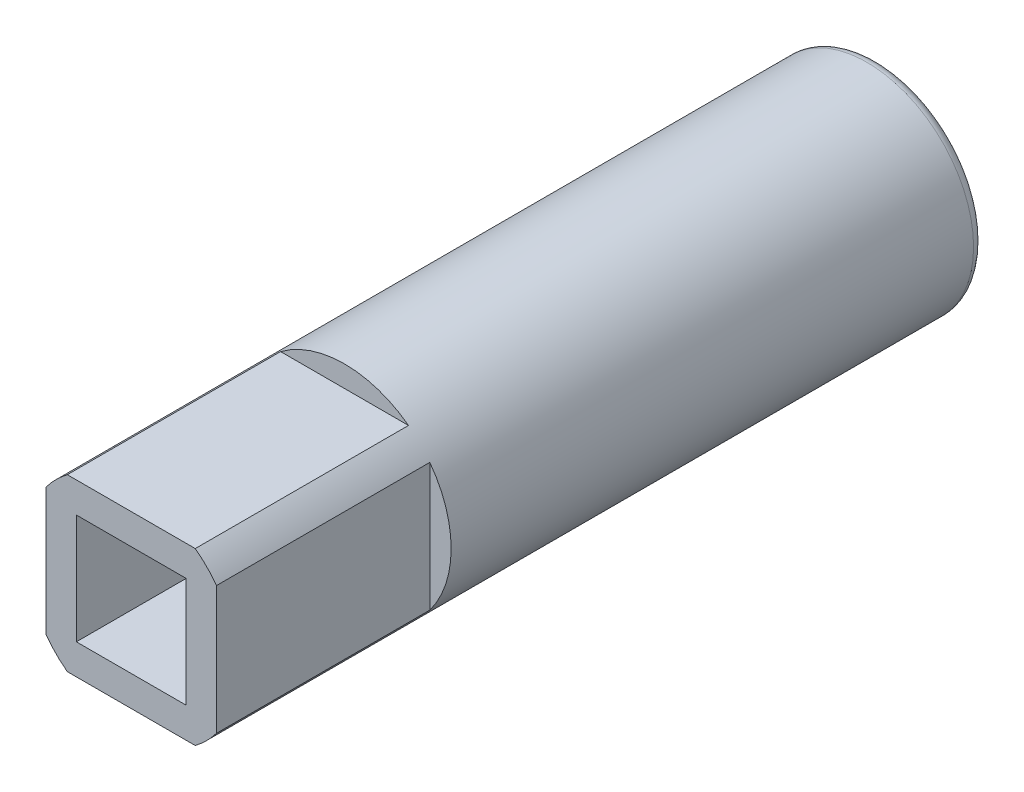
ISO-10303-21;
HEADER;
FILE_DESCRIPTION(('STEP AP214'),'2;1');
FILE_NAME('part.step','',(''),(''),'','','');
FILE_SCHEMA(('AUTOMOTIVE_DESIGN { 1 0 10303 214 1 1 1 1 }'));
ENDSEC;
DATA;
#1=APPLICATION_CONTEXT('core data for automotive mechanical design processes');
#2=APPLICATION_PROTOCOL_DEFINITION('international standard','automotive_design',2000,#1);
#3=PRODUCT_CONTEXT('',#1,'mechanical');
#4=PRODUCT('Part','Part','',(#3));
#5=PRODUCT_RELATED_PRODUCT_CATEGORY('part','',(#4));
#6=PRODUCT_DEFINITION_FORMATION('','',#4);
#7=PRODUCT_DEFINITION_CONTEXT('part definition',#1,'design');
#8=PRODUCT_DEFINITION('design','',#6,#7);
#9=PRODUCT_DEFINITION_SHAPE('','',#8);
#10=(LENGTH_UNIT() NAMED_UNIT(*) SI_UNIT(.MILLI.,.METRE.));
#11=(NAMED_UNIT(*) PLANE_ANGLE_UNIT() SI_UNIT($,.RADIAN.));
#12=(NAMED_UNIT(*) SI_UNIT($,.STERADIAN.) SOLID_ANGLE_UNIT());
#13=UNCERTAINTY_MEASURE_WITH_UNIT(LENGTH_MEASURE(1.E-05),#10,'distance_accuracy_value','');
#14=(GEOMETRIC_REPRESENTATION_CONTEXT(3) GLOBAL_UNCERTAINTY_ASSIGNED_CONTEXT((#13)) GLOBAL_UNIT_ASSIGNED_CONTEXT((#10,
#11,#12)) REPRESENTATION_CONTEXT('',''));
#15=CARTESIAN_POINT('',(0.,0.,0.));
#16=DIRECTION('',(0.,0.,1.));
#17=DIRECTION('',(1.,0.,0.));
#18=AXIS2_PLACEMENT_3D('',#15,#16,#17);
#19=CARTESIAN_POINT('',(0.,0.,25.));
#20=DIRECTION('',(0.,0.,1.));
#21=DIRECTION('',(1.,0.,0.));
#22=AXIS2_PLACEMENT_3D('',#19,#20,#21);
#23=PLANE('',#22);
#24=CARTESIAN_POINT('',(0.,0.,25.));
#25=DIRECTION('',(0.,0.,1.));
#26=DIRECTION('',(1.,0.,0.));
#27=AXIS2_PLACEMENT_3D('',#24,#25,#26);
#28=CIRCLE('',#27,5.);
#29=CARTESIAN_POINT('',(-4.,3.,25.));
#30=VERTEX_POINT('',#29);
#31=CARTESIAN_POINT('',(-4.,-3.,25.));
#32=VERTEX_POINT('',#31);
#33=EDGE_CURVE('E328',#30,#32,#28,.T.);
#34=ORIENTED_EDGE('',*,*,#33,.T.);
#35=DIRECTION('',(0.,1.,0.));
#36=VECTOR('',#35,1.);
#37=CARTESIAN_POINT('',(-4.,0.,25.));
#38=LINE('',#37,#36);
#39=EDGE_CURVE('E237',#32,#30,#38,.T.);
#40=ORIENTED_EDGE('',*,*,#39,.T.);
#41=EDGE_LOOP('',(#34,#40));
#42=FACE_BOUND('',#41,.T.);
#43=ADVANCED_FACE('F50',(#42),#23,.T.);
#44=CARTESIAN_POINT('',(3.,4.,25.));
#45=VERTEX_POINT('',#44);
#46=CARTESIAN_POINT('',(-3.,4.,25.));
#47=VERTEX_POINT('',#46);
#48=EDGE_CURVE('E324',#45,#47,#28,.T.);
#49=ORIENTED_EDGE('',*,*,#48,.T.);
#50=DIRECTION('',(1.,0.,0.));
#51=VECTOR('',#50,1.);
#52=CARTESIAN_POINT('',(0.,4.,25.));
#53=LINE('',#52,#51);
#54=EDGE_CURVE('E236',#47,#45,#53,.T.);
#55=ORIENTED_EDGE('',*,*,#54,.T.);
#56=EDGE_LOOP('',(#49,#55));
#57=FACE_BOUND('',#56,.T.);
#58=ADVANCED_FACE('F368',(#57),#23,.T.);
#59=DIRECTION('',(1.,0.,0.));
#60=VECTOR('',#59,1.);
#61=CARTESIAN_POINT('',(0.,-4.,25.));
#62=LINE('',#61,#60);
#63=CARTESIAN_POINT('',(-3.,-4.,25.));
#64=VERTEX_POINT('',#63);
#65=CARTESIAN_POINT('',(3.,-4.,25.));
#66=VERTEX_POINT('',#65);
#67=EDGE_CURVE('E216',#64,#66,#62,.T.);
#68=ORIENTED_EDGE('',*,*,#67,.F.);
#69=EDGE_CURVE('E325',#64,#66,#28,.T.);
#70=ORIENTED_EDGE('',*,*,#69,.T.);
#71=EDGE_LOOP('',(#68,#70));
#72=FACE_BOUND('',#71,.T.);
#73=ADVANCED_FACE('F336',(#72),#23,.T.);
#74=CARTESIAN_POINT('',(0.,0.,25.));
#75=DIRECTION('',(0.,0.,-1.));
#76=DIRECTION('',(-1.,0.,0.));
#77=AXIS2_PLACEMENT_3D('',#74,#75,#76);
#78=CYLINDRICAL_SURFACE('',#77,5.);
#79=CARTESIAN_POINT('',(0.,0.,0.5));
#80=DIRECTION('',(0.,0.,1.));
#81=DIRECTION('',(1.,0.,0.));
#82=AXIS2_PLACEMENT_3D('',#79,#80,#81);
#83=CIRCLE('',#82,5.);
#84=CARTESIAN_POINT('',(5.,0.,0.5));
#85=VERTEX_POINT('',#84);
#86=EDGE_CURVE('E57',#85,#85,#83,.T.);
#87=ORIENTED_EDGE('',*,*,#86,.T.);
#88=EDGE_LOOP('',(#87));
#89=FACE_BOUND('',#88,.T.);
#90=ORIENTED_EDGE('',*,*,#48,.F.);
#91=DIRECTION('',(0.,0.,-1.));
#92=VECTOR('',#91,1.);
#93=CARTESIAN_POINT('',(3.,4.,35.));
#94=LINE('',#93,#92);
#95=CARTESIAN_POINT('',(3.,4.,35.));
#96=VERTEX_POINT('',#95);
#97=EDGE_CURVE('E263',#96,#45,#94,.T.);
#98=ORIENTED_EDGE('',*,*,#97,.F.);
#99=CARTESIAN_POINT('',(0.,0.,35.));
#100=DIRECTION('',(0.,0.,1.));
#101=DIRECTION('',(1.,0.,0.));
#102=AXIS2_PLACEMENT_3D('',#99,#100,#101);
#103=CIRCLE('',#102,5.);
#104=CARTESIAN_POINT('',(4.,3.,35.));
#105=VERTEX_POINT('',#104);
#106=EDGE_CURVE('E217',#105,#96,#103,.T.);
#107=ORIENTED_EDGE('',*,*,#106,.F.);
#108=DIRECTION('',(0.,0.,-1.));
#109=VECTOR('',#108,1.);
#110=CARTESIAN_POINT('',(4.,3.,35.));
#111=LINE('',#110,#109);
#112=CARTESIAN_POINT('',(4.,3.,25.));
#113=VERTEX_POINT('',#112);
#114=EDGE_CURVE('E269',#105,#113,#111,.T.);
#115=ORIENTED_EDGE('',*,*,#114,.T.);
#116=CARTESIAN_POINT('',(4.,-3.,25.));
#117=VERTEX_POINT('',#116);
#118=EDGE_CURVE('E311',#117,#113,#28,.T.);
#119=ORIENTED_EDGE('',*,*,#118,.F.);
#120=DIRECTION('',(0.,0.,-1.));
#121=VECTOR('',#120,1.);
#122=CARTESIAN_POINT('',(4.,-3.,35.));
#123=LINE('',#122,#121);
#124=CARTESIAN_POINT('',(4.,-3.,35.));
#125=VERTEX_POINT('',#124);
#126=EDGE_CURVE('E275',#125,#117,#123,.T.);
#127=ORIENTED_EDGE('',*,*,#126,.F.);
#128=CARTESIAN_POINT('',(3.,-4.,35.));
#129=VERTEX_POINT('',#128);
#130=EDGE_CURVE('E212',#129,#125,#103,.T.);
#131=ORIENTED_EDGE('',*,*,#130,.F.);
#132=DIRECTION('',(0.,0.,-1.));
#133=VECTOR('',#132,1.);
#134=CARTESIAN_POINT('',(3.,-4.,35.));
#135=LINE('',#134,#133);
#136=EDGE_CURVE('E231',#129,#66,#135,.T.);
#137=ORIENTED_EDGE('',*,*,#136,.T.);
#138=ORIENTED_EDGE('',*,*,#69,.F.);
#139=DIRECTION('',(0.,0.,-1.));
#140=VECTOR('',#139,1.);
#141=CARTESIAN_POINT('',(-3.,-4.,35.));
#142=LINE('',#141,#140);
#143=CARTESIAN_POINT('',(-3.,-4.,35.));
#144=VERTEX_POINT('',#143);
#145=EDGE_CURVE('E247',#144,#64,#142,.T.);
#146=ORIENTED_EDGE('',*,*,#145,.F.);
#147=CARTESIAN_POINT('',(-4.,-3.,35.));
#148=VERTEX_POINT('',#147);
#149=EDGE_CURVE('E220',#148,#144,#103,.T.);
#150=ORIENTED_EDGE('',*,*,#149,.F.);
#151=DIRECTION('',(0.,0.,-1.));
#152=VECTOR('',#151,1.);
#153=CARTESIAN_POINT('',(-4.,-3.,35.));
#154=LINE('',#153,#152);
#155=EDGE_CURVE('E255',#148,#32,#154,.T.);
#156=ORIENTED_EDGE('',*,*,#155,.T.);
#157=ORIENTED_EDGE('',*,*,#33,.F.);
#158=DIRECTION('',(0.,0.,-1.));
#159=VECTOR('',#158,1.);
#160=CARTESIAN_POINT('',(-4.,3.,35.));
#161=LINE('',#160,#159);
#162=CARTESIAN_POINT('',(-4.,3.,35.));
#163=VERTEX_POINT('',#162);
#164=EDGE_CURVE('E257',#163,#30,#161,.T.);
#165=ORIENTED_EDGE('',*,*,#164,.F.);
#166=CARTESIAN_POINT('',(-3.,4.,35.));
#167=VERTEX_POINT('',#166);
#168=EDGE_CURVE('E225',#167,#163,#103,.T.);
#169=ORIENTED_EDGE('',*,*,#168,.F.);
#170=DIRECTION('',(0.,0.,-1.));
#171=VECTOR('',#170,1.);
#172=CARTESIAN_POINT('',(-3.,4.,35.));
#173=LINE('',#172,#171);
#174=EDGE_CURVE('E258',#167,#47,#173,.T.);
#175=ORIENTED_EDGE('',*,*,#174,.T.);
#176=EDGE_LOOP('',(#90,#98,#107,#115,#119,#127,#131,#137,#138,#146,#150,#156,#157,#165,#169,#175));
#177=FACE_BOUND('',#176,.T.);
#178=ADVANCED_FACE('F346',(#89,#177),#78,.T.);
#179=DIRECTION('',(0.,1.,0.));
#180=VECTOR('',#179,1.);
#181=CARTESIAN_POINT('',(4.,0.,25.));
#182=LINE('',#181,#180);
#183=EDGE_CURVE('E69',#117,#113,#182,.T.);
#184=ORIENTED_EDGE('',*,*,#183,.F.);
#185=ORIENTED_EDGE('',*,*,#118,.T.);
#186=EDGE_LOOP('',(#184,#185));
#187=FACE_BOUND('',#186,.T.);
#188=ADVANCED_FACE('F369',(#187),#23,.T.);
#189=CARTESIAN_POINT('',(0.,0.,0.));
#190=DIRECTION('',(0.,0.,1.));
#191=DIRECTION('',(1.,0.,0.));
#192=AXIS2_PLACEMENT_3D('',#189,#190,#191);
#193=PLANE('',#192);
#194=CARTESIAN_POINT('',(0.,0.,0.));
#195=DIRECTION('',(0.,0.,1.));
#196=DIRECTION('',(1.,0.,0.));
#197=AXIS2_PLACEMENT_3D('',#194,#195,#196);
#198=CIRCLE('',#197,4.5);
#199=CARTESIAN_POINT('',(4.5,0.,0.));
#200=VERTEX_POINT('',#199);
#201=EDGE_CURVE('E11',#200,#200,#198,.F.);
#202=ORIENTED_EDGE('',*,*,#201,.T.);
#203=EDGE_LOOP('',(#202));
#204=FACE_BOUND('',#203,.T.);
#205=DIRECTION('',(1.,0.,0.));
#206=VECTOR('',#205,1.);
#207=CARTESIAN_POINT('',(2.19845926514363,1.81363636363636,0.));
#208=LINE('',#207,#206);
#209=CARTESIAN_POINT('',(-2.19845926514363,1.81363636363636,0.));
#210=VERTEX_POINT('',#209);
#211=CARTESIAN_POINT('',(2.19845926514363,1.81363636363636,0.));
#212=VERTEX_POINT('',#211);
#213=EDGE_CURVE('E300',#210,#212,#208,.T.);
#214=ORIENTED_EDGE('',*,*,#213,.F.);
#215=CARTESIAN_POINT('',(0.,0.,0.));
#216=DIRECTION('',(0.,0.,-1.));
#217=DIRECTION('',(-1.,0.,0.));
#218=AXIS2_PLACEMENT_3D('',#215,#216,#217);
#219=CIRCLE('',#218,2.85);
#220=CARTESIAN_POINT('',(-2.221320345,-1.78556319543417,0.));
#221=VERTEX_POINT('',#220);
#222=EDGE_CURVE('E277',#221,#210,#219,.T.);
#223=ORIENTED_EDGE('',*,*,#222,.F.);
#224=DIRECTION('',(-1.,0.,0.));
#225=VECTOR('',#224,1.);
#226=CARTESIAN_POINT('',(2.221320345,-1.78556319543417,0.));
#227=LINE('',#226,#225);
#228=CARTESIAN_POINT('',(2.221320345,-1.78556319543417,0.));
#229=VERTEX_POINT('',#228);
#230=EDGE_CURVE('E285',#229,#221,#227,.T.);
#231=ORIENTED_EDGE('',*,*,#230,.F.);
#232=CARTESIAN_POINT('',(0.,0.,0.));
#233=DIRECTION('',(0.,0.,-1.));
#234=DIRECTION('',(-1.,0.,0.));
#235=AXIS2_PLACEMENT_3D('',#232,#233,#234);
#236=CIRCLE('',#235,2.85);
#237=EDGE_CURVE('E301',#212,#229,#236,.T.);
#238=ORIENTED_EDGE('',*,*,#237,.F.);
#239=EDGE_LOOP('',(#214,#223,#231,#238));
#240=FACE_BOUND('',#239,.T.);
#241=ADVANCED_FACE('F377',(#204,#240),#193,.F.);
#242=CARTESIAN_POINT('',(0.,0.,8.));
#243=DIRECTION('',(0.,0.,-1.));
#244=DIRECTION('',(-1.,0.,0.));
#245=AXIS2_PLACEMENT_3D('',#242,#243,#244);
#246=CYLINDRICAL_SURFACE('',#245,2.85);
#247=ORIENTED_EDGE('',*,*,#222,.T.);
#248=DIRECTION('',(0.,0.,-1.));
#249=VECTOR('',#248,1.);
#250=CARTESIAN_POINT('',(-2.19845926514363,1.81363636363636,8.));
#251=LINE('',#250,#249);
#252=CARTESIAN_POINT('',(-2.19845926514363,1.81363636363636,8.));
#253=VERTEX_POINT('',#252);
#254=EDGE_CURVE('E295',#253,#210,#251,.T.);
#255=ORIENTED_EDGE('',*,*,#254,.F.);
#256=CARTESIAN_POINT('',(0.,0.,8.));
#257=DIRECTION('',(0.,0.,-1.));
#258=DIRECTION('',(-1.,0.,0.));
#259=AXIS2_PLACEMENT_3D('',#256,#257,#258);
#260=CIRCLE('',#259,2.85);
#261=CARTESIAN_POINT('',(-2.221320345,-1.78556319543417,8.));
#262=VERTEX_POINT('',#261);
#263=EDGE_CURVE('E280',#262,#253,#260,.T.);
#264=ORIENTED_EDGE('',*,*,#263,.F.);
#265=DIRECTION('',(0.,0.,-1.));
#266=VECTOR('',#265,1.);
#267=CARTESIAN_POINT('',(-2.221320345,-1.78556319543417,8.));
#268=LINE('',#267,#266);
#269=EDGE_CURVE('E308',#262,#221,#268,.T.);
#270=ORIENTED_EDGE('',*,*,#269,.T.);
#271=EDGE_LOOP('',(#247,#255,#264,#270));
#272=FACE_BOUND('',#271,.T.);
#273=ADVANCED_FACE('F381',(#272),#246,.F.);
#274=CARTESIAN_POINT('',(2.221320345,-1.78556319543417,8.));
#275=DIRECTION('',(0.,-1.,0.));
#276=DIRECTION('',(0.,0.,-1.));
#277=AXIS2_PLACEMENT_3D('',#274,#275,#276);
#278=PLANE('',#277);
#279=ORIENTED_EDGE('',*,*,#230,.T.);
#280=ORIENTED_EDGE('',*,*,#269,.F.);
#281=DIRECTION('',(-1.,0.,0.));
#282=VECTOR('',#281,1.);
#283=CARTESIAN_POINT('',(2.221320345,-1.78556319543417,8.));
#284=LINE('',#283,#282);
#285=CARTESIAN_POINT('',(2.221320345,-1.78556319543417,8.));
#286=VERTEX_POINT('',#285);
#287=EDGE_CURVE('E290',#286,#262,#284,.T.);
#288=ORIENTED_EDGE('',*,*,#287,.F.);
#289=DIRECTION('',(0.,0.,-1.));
#290=VECTOR('',#289,1.);
#291=CARTESIAN_POINT('',(2.221320345,-1.78556319543417,8.));
#292=LINE('',#291,#290);
#293=EDGE_CURVE('E315',#286,#229,#292,.T.);
#294=ORIENTED_EDGE('',*,*,#293,.T.);
#295=EDGE_LOOP('',(#279,#280,#288,#294));
#296=FACE_BOUND('',#295,.T.);
#297=ADVANCED_FACE('F543',(#296),#278,.F.);
#298=CARTESIAN_POINT('',(0.,0.,8.));
#299=DIRECTION('',(0.,0.,-1.));
#300=DIRECTION('',(-1.,0.,0.));
#301=AXIS2_PLACEMENT_3D('',#298,#299,#300);
#302=CYLINDRICAL_SURFACE('',#301,2.85);
#303=ORIENTED_EDGE('',*,*,#237,.T.);
#304=ORIENTED_EDGE('',*,*,#293,.F.);
#305=CARTESIAN_POINT('',(0.,0.,8.));
#306=DIRECTION('',(0.,0.,-1.));
#307=DIRECTION('',(-1.,0.,0.));
#308=AXIS2_PLACEMENT_3D('',#305,#306,#307);
#309=CIRCLE('',#308,2.85);
#310=CARTESIAN_POINT('',(2.19845926514363,1.81363636363636,8.));
#311=VERTEX_POINT('',#310);
#312=EDGE_CURVE('E286',#311,#286,#309,.T.);
#313=ORIENTED_EDGE('',*,*,#312,.F.);
#314=DIRECTION('',(0.,0.,-1.));
#315=VECTOR('',#314,1.);
#316=CARTESIAN_POINT('',(2.19845926514363,1.81363636363636,8.));
#317=LINE('',#316,#315);
#318=EDGE_CURVE('E314',#311,#212,#317,.T.);
#319=ORIENTED_EDGE('',*,*,#318,.T.);
#320=EDGE_LOOP('',(#303,#304,#313,#319));
#321=FACE_BOUND('',#320,.T.);
#322=ADVANCED_FACE('F551',(#321),#302,.F.);
#323=CARTESIAN_POINT('',(2.19845926514363,1.81363636363636,8.));
#324=DIRECTION('',(0.,1.,0.));
#325=DIRECTION('',(0.,0.,1.));
#326=AXIS2_PLACEMENT_3D('',#323,#324,#325);
#327=PLANE('',#326);
#328=ORIENTED_EDGE('',*,*,#213,.T.);
#329=ORIENTED_EDGE('',*,*,#318,.F.);
#330=DIRECTION('',(1.,0.,0.));
#331=VECTOR('',#330,1.);
#332=CARTESIAN_POINT('',(2.19845926514363,1.81363636363636,8.));
#333=LINE('',#332,#331);
#334=EDGE_CURVE('E281',#253,#311,#333,.T.);
#335=ORIENTED_EDGE('',*,*,#334,.F.);
#336=ORIENTED_EDGE('',*,*,#254,.T.);
#337=EDGE_LOOP('',(#328,#329,#335,#336));
#338=FACE_BOUND('',#337,.T.);
#339=ADVANCED_FACE('F563',(#338),#327,.F.);
#340=CARTESIAN_POINT('',(0.,0.,8.));
#341=DIRECTION('',(0.,0.,-1.));
#342=DIRECTION('',(-1.,0.,0.));
#343=AXIS2_PLACEMENT_3D('',#340,#341,#342);
#344=PLANE('',#343);
#345=ORIENTED_EDGE('',*,*,#263,.T.);
#346=ORIENTED_EDGE('',*,*,#334,.T.);
#347=ORIENTED_EDGE('',*,*,#312,.T.);
#348=ORIENTED_EDGE('',*,*,#287,.T.);
#349=EDGE_LOOP('',(#345,#346,#347,#348));
#350=FACE_BOUND('',#349,.T.);
#351=ADVANCED_FACE('F441',(#350),#344,.T.);
#352=CARTESIAN_POINT('',(4.,0.,35.));
#353=DIRECTION('',(-1.,0.,0.));
#354=DIRECTION('',(0.,0.,1.));
#355=AXIS2_PLACEMENT_3D('',#352,#353,#354);
#356=PLANE('',#355);
#357=ORIENTED_EDGE('',*,*,#183,.T.);
#358=ORIENTED_EDGE('',*,*,#114,.F.);
#359=DIRECTION('',(0.,1.,0.));
#360=VECTOR('',#359,1.);
#361=CARTESIAN_POINT('',(4.,0.,35.));
#362=LINE('',#361,#360);
#363=EDGE_CURVE('E213',#125,#105,#362,.T.);
#364=ORIENTED_EDGE('',*,*,#363,.F.);
#365=ORIENTED_EDGE('',*,*,#126,.T.);
#366=EDGE_LOOP('',(#357,#358,#364,#365));
#367=FACE_BOUND('',#366,.T.);
#368=ADVANCED_FACE('F440',(#367),#356,.F.);
#369=CARTESIAN_POINT('',(0.,4.,35.));
#370=DIRECTION('',(0.,1.,0.));
#371=DIRECTION('',(0.,0.,1.));
#372=AXIS2_PLACEMENT_3D('',#369,#370,#371);
#373=PLANE('',#372);
#374=ORIENTED_EDGE('',*,*,#54,.F.);
#375=ORIENTED_EDGE('',*,*,#174,.F.);
#376=DIRECTION('',(1.,0.,0.));
#377=VECTOR('',#376,1.);
#378=CARTESIAN_POINT('',(0.,4.,35.));
#379=LINE('',#378,#377);
#380=EDGE_CURVE('E221',#167,#96,#379,.T.);
#381=ORIENTED_EDGE('',*,*,#380,.T.);
#382=ORIENTED_EDGE('',*,*,#97,.T.);
#383=EDGE_LOOP('',(#374,#375,#381,#382));
#384=FACE_BOUND('',#383,.T.);
#385=ADVANCED_FACE('F361',(#384),#373,.T.);
#386=CARTESIAN_POINT('',(-4.,0.,35.));
#387=DIRECTION('',(-1.,0.,0.));
#388=DIRECTION('',(0.,0.,1.));
#389=AXIS2_PLACEMENT_3D('',#386,#387,#388);
#390=PLANE('',#389);
#391=ORIENTED_EDGE('',*,*,#39,.F.);
#392=ORIENTED_EDGE('',*,*,#155,.F.);
#393=DIRECTION('',(0.,1.,0.));
#394=VECTOR('',#393,1.);
#395=CARTESIAN_POINT('',(-4.,0.,35.));
#396=LINE('',#395,#394);
#397=EDGE_CURVE('E228',#148,#163,#396,.T.);
#398=ORIENTED_EDGE('',*,*,#397,.T.);
#399=ORIENTED_EDGE('',*,*,#164,.T.);
#400=EDGE_LOOP('',(#391,#392,#398,#399));
#401=FACE_BOUND('',#400,.T.);
#402=ADVANCED_FACE('F366',(#401),#390,.T.);
#403=CARTESIAN_POINT('',(0.,-4.,35.));
#404=DIRECTION('',(0.,1.,0.));
#405=DIRECTION('',(0.,0.,1.));
#406=AXIS2_PLACEMENT_3D('',#403,#404,#405);
#407=PLANE('',#406);
#408=ORIENTED_EDGE('',*,*,#67,.T.);
#409=ORIENTED_EDGE('',*,*,#136,.F.);
#410=DIRECTION('',(1.,0.,0.));
#411=VECTOR('',#410,1.);
#412=CARTESIAN_POINT('',(0.,-4.,35.));
#413=LINE('',#412,#411);
#414=EDGE_CURVE('E229',#144,#129,#413,.T.);
#415=ORIENTED_EDGE('',*,*,#414,.F.);
#416=ORIENTED_EDGE('',*,*,#145,.T.);
#417=EDGE_LOOP('',(#408,#409,#415,#416));
#418=FACE_BOUND('',#417,.T.);
#419=ADVANCED_FACE('F344',(#418),#407,.F.);
#420=CARTESIAN_POINT('',(0.,0.,35.));
#421=DIRECTION('',(0.,0.,1.));
#422=DIRECTION('',(1.,0.,0.));
#423=AXIS2_PLACEMENT_3D('',#420,#421,#422);
#424=PLANE('',#423);
#425=DIRECTION('',(0.,1.,0.));
#426=VECTOR('',#425,1.);
#427=CARTESIAN_POINT('',(2.575,-2.575,35.));
#428=LINE('',#427,#426);
#429=CARTESIAN_POINT('',(2.575,-2.575,35.));
#430=VERTEX_POINT('',#429);
#431=CARTESIAN_POINT('',(2.575,2.575,35.));
#432=VERTEX_POINT('',#431);
#433=EDGE_CURVE('E64',#430,#432,#428,.T.);
#434=ORIENTED_EDGE('',*,*,#433,.F.);
#435=DIRECTION('',(1.,0.,0.));
#436=VECTOR('',#435,1.);
#437=CARTESIAN_POINT('',(-2.575,-2.575,35.));
#438=LINE('',#437,#436);
#439=CARTESIAN_POINT('',(-2.575,-2.575,35.));
#440=VERTEX_POINT('',#439);
#441=EDGE_CURVE('E183',#440,#430,#438,.T.);
#442=ORIENTED_EDGE('',*,*,#441,.F.);
#443=DIRECTION('',(0.,-1.,0.));
#444=VECTOR('',#443,1.);
#445=CARTESIAN_POINT('',(-2.575,-2.575,35.));
#446=LINE('',#445,#444);
#447=CARTESIAN_POINT('',(-2.575,2.575,35.));
#448=VERTEX_POINT('',#447);
#449=EDGE_CURVE('E189',#448,#440,#446,.T.);
#450=ORIENTED_EDGE('',*,*,#449,.F.);
#451=DIRECTION('',(-1.,0.,0.));
#452=VECTOR('',#451,1.);
#453=CARTESIAN_POINT('',(-2.575,2.575,35.));
#454=LINE('',#453,#452);
#455=EDGE_CURVE('E200',#432,#448,#454,.T.);
#456=ORIENTED_EDGE('',*,*,#455,.F.);
#457=EDGE_LOOP('',(#434,#442,#450,#456));
#458=FACE_BOUND('',#457,.T.);
#459=ORIENTED_EDGE('',*,*,#130,.T.);
#460=ORIENTED_EDGE('',*,*,#363,.T.);
#461=ORIENTED_EDGE('',*,*,#106,.T.);
#462=ORIENTED_EDGE('',*,*,#380,.F.);
#463=ORIENTED_EDGE('',*,*,#168,.T.);
#464=ORIENTED_EDGE('',*,*,#397,.F.);
#465=ORIENTED_EDGE('',*,*,#149,.T.);
#466=ORIENTED_EDGE('',*,*,#414,.T.);
#467=EDGE_LOOP('',(#459,#460,#461,#462,#463,#464,#465,#466));
#468=FACE_BOUND('',#467,.T.);
#469=ADVANCED_FACE('F348',(#458,#468),#424,.T.);
#470=CARTESIAN_POINT('',(2.575,-2.575,25.));
#471=DIRECTION('',(1.,0.,0.));
#472=DIRECTION('',(0.,0.,-1.));
#473=AXIS2_PLACEMENT_3D('',#470,#471,#472);
#474=PLANE('',#473);
#475=ORIENTED_EDGE('',*,*,#433,.T.);
#476=DIRECTION('',(0.,0.,1.));
#477=VECTOR('',#476,1.);
#478=CARTESIAN_POINT('',(2.575,2.575,25.));
#479=LINE('',#478,#477);
#480=CARTESIAN_POINT('',(2.575,2.575,25.));
#481=VERTEX_POINT('',#480);
#482=EDGE_CURVE('E158',#481,#432,#479,.T.);
#483=ORIENTED_EDGE('',*,*,#482,.F.);
#484=DIRECTION('',(0.,1.,0.));
#485=VECTOR('',#484,1.);
#486=CARTESIAN_POINT('',(2.575,-2.575,25.));
#487=LINE('',#486,#485);
#488=CARTESIAN_POINT('',(2.575,-2.575,25.));
#489=VERTEX_POINT('',#488);
#490=EDGE_CURVE('E161',#489,#481,#487,.T.);
#491=ORIENTED_EDGE('',*,*,#490,.F.);
#492=DIRECTION('',(0.,0.,1.));
#493=VECTOR('',#492,1.);
#494=CARTESIAN_POINT('',(2.575,-2.575,25.));
#495=LINE('',#494,#493);
#496=EDGE_CURVE('E204',#489,#430,#495,.T.);
#497=ORIENTED_EDGE('',*,*,#496,.T.);
#498=EDGE_LOOP('',(#475,#483,#491,#497));
#499=FACE_BOUND('',#498,.T.);
#500=ADVANCED_FACE('F163',(#499),#474,.F.);
#501=CARTESIAN_POINT('',(-2.575,-2.575,25.));
#502=DIRECTION('',(0.,-1.,0.));
#503=DIRECTION('',(0.,0.,-1.));
#504=AXIS2_PLACEMENT_3D('',#501,#502,#503);
#505=PLANE('',#504);
#506=ORIENTED_EDGE('',*,*,#441,.T.);
#507=ORIENTED_EDGE('',*,*,#496,.F.);
#508=DIRECTION('',(1.,0.,0.));
#509=VECTOR('',#508,1.);
#510=CARTESIAN_POINT('',(-2.575,-2.575,25.));
#511=LINE('',#510,#509);
#512=CARTESIAN_POINT('',(-2.575,-2.575,25.));
#513=VERTEX_POINT('',#512);
#514=EDGE_CURVE('E167',#513,#489,#511,.T.);
#515=ORIENTED_EDGE('',*,*,#514,.F.);
#516=DIRECTION('',(0.,0.,1.));
#517=VECTOR('',#516,1.);
#518=CARTESIAN_POINT('',(-2.575,-2.575,25.));
#519=LINE('',#518,#517);
#520=EDGE_CURVE('E207',#513,#440,#519,.T.);
#521=ORIENTED_EDGE('',*,*,#520,.T.);
#522=EDGE_LOOP('',(#506,#507,#515,#521));
#523=FACE_BOUND('',#522,.T.);
#524=ADVANCED_FACE('F483',(#523),#505,.F.);
#525=CARTESIAN_POINT('',(-2.575,-2.575,25.));
#526=DIRECTION('',(-1.,0.,0.));
#527=DIRECTION('',(0.,0.,1.));
#528=AXIS2_PLACEMENT_3D('',#525,#526,#527);
#529=PLANE('',#528);
#530=ORIENTED_EDGE('',*,*,#449,.T.);
#531=ORIENTED_EDGE('',*,*,#520,.F.);
#532=DIRECTION('',(0.,-1.,0.));
#533=VECTOR('',#532,1.);
#534=CARTESIAN_POINT('',(-2.575,-2.575,25.));
#535=LINE('',#534,#533);
#536=CARTESIAN_POINT('',(-2.575,2.575,25.));
#537=VERTEX_POINT('',#536);
#538=EDGE_CURVE('E177',#537,#513,#535,.T.);
#539=ORIENTED_EDGE('',*,*,#538,.F.);
#540=DIRECTION('',(0.,0.,1.));
#541=VECTOR('',#540,1.);
#542=CARTESIAN_POINT('',(-2.575,2.575,25.));
#543=LINE('',#542,#541);
#544=EDGE_CURVE('E169',#537,#448,#543,.T.);
#545=ORIENTED_EDGE('',*,*,#544,.T.);
#546=EDGE_LOOP('',(#530,#531,#539,#545));
#547=FACE_BOUND('',#546,.T.);
#548=ADVANCED_FACE('F491',(#547),#529,.F.);
#549=CARTESIAN_POINT('',(-2.575,2.575,25.));
#550=DIRECTION('',(0.,1.,0.));
#551=DIRECTION('',(0.,0.,1.));
#552=AXIS2_PLACEMENT_3D('',#549,#550,#551);
#553=PLANE('',#552);
#554=ORIENTED_EDGE('',*,*,#455,.T.);
#555=ORIENTED_EDGE('',*,*,#544,.F.);
#556=DIRECTION('',(-1.,0.,0.));
#557=VECTOR('',#556,1.);
#558=CARTESIAN_POINT('',(-2.575,2.575,25.));
#559=LINE('',#558,#557);
#560=EDGE_CURVE('E173',#481,#537,#559,.T.);
#561=ORIENTED_EDGE('',*,*,#560,.F.);
#562=ORIENTED_EDGE('',*,*,#482,.T.);
#563=EDGE_LOOP('',(#554,#555,#561,#562));
#564=FACE_BOUND('',#563,.T.);
#565=ADVANCED_FACE('F172',(#564),#553,.F.);
#566=CARTESIAN_POINT('',(0.,0.,25.));
#567=DIRECTION('',(0.,0.,-1.));
#568=DIRECTION('',(-1.,0.,0.));
#569=AXIS2_PLACEMENT_3D('',#566,#567,#568);
#570=PLANE('',#569);
#571=ORIENTED_EDGE('',*,*,#490,.T.);
#572=ORIENTED_EDGE('',*,*,#560,.T.);
#573=ORIENTED_EDGE('',*,*,#538,.T.);
#574=ORIENTED_EDGE('',*,*,#514,.T.);
#575=EDGE_LOOP('',(#571,#572,#573,#574));
#576=FACE_BOUND('',#575,.T.);
#577=ADVANCED_FACE('F181',(#576),#570,.F.);
#578=CARTESIAN_POINT('',(0.,0.,0.5));
#579=DIRECTION('',(0.,0.,1.));
#580=DIRECTION('',(1.,0.,0.));
#581=AXIS2_PLACEMENT_3D('',#578,#579,#580);
#582=TOROIDAL_SURFACE('',#581,4.5,0.5);
#583=ORIENTED_EDGE('',*,*,#201,.F.);
#584=EDGE_LOOP('',(#583));
#585=FACE_BOUND('',#584,.T.);
#586=ORIENTED_EDGE('',*,*,#86,.F.);
#587=EDGE_LOOP('',(#586));
#588=FACE_BOUND('',#587,.T.);
#589=ADVANCED_FACE('F47',(#585,#588),#582,.T.);
#590=CLOSED_SHELL('',(#43,#58,#73,#178,#188,#241,#273,#297,#322,#339,#351,#368,#385,#402,#419,
#469,#500,#524,#548,#565,#577,#589));
#591=MANIFOLD_SOLID_BREP('B2',#590);
#592=ADVANCED_BREP_SHAPE_REPRESENTATION('',(#18,#591),#14);
#593=SHAPE_DEFINITION_REPRESENTATION(#9,#592);
ENDSEC;
END-ISO-10303-21;
